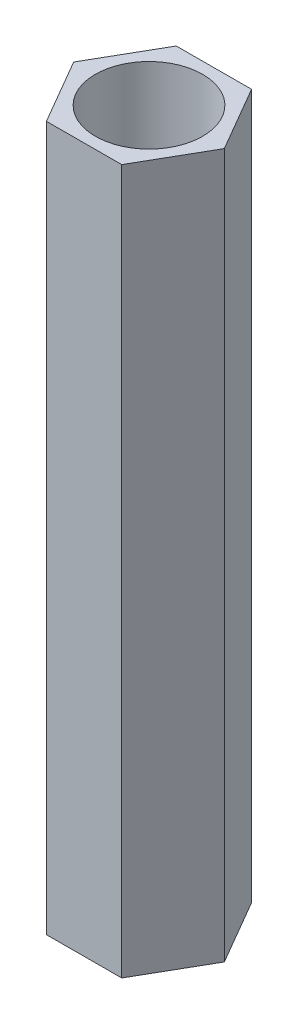
ISO-10303-21;
HEADER;
FILE_DESCRIPTION(('STEP AP214'),'2;1');
FILE_NAME('part.step','',(''),(''),'','','');
FILE_SCHEMA(('AUTOMOTIVE_DESIGN { 1 0 10303 214 1 1 1 1 }'));
ENDSEC;
DATA;
#1=APPLICATION_CONTEXT('core data for automotive mechanical design processes');
#2=APPLICATION_PROTOCOL_DEFINITION('international standard','automotive_design',2000,#1);
#3=PRODUCT_CONTEXT('',#1,'mechanical');
#4=PRODUCT('Part','Part','',(#3));
#5=PRODUCT_RELATED_PRODUCT_CATEGORY('part','',(#4));
#6=PRODUCT_DEFINITION_FORMATION('','',#4);
#7=PRODUCT_DEFINITION_CONTEXT('part definition',#1,'design');
#8=PRODUCT_DEFINITION('design','',#6,#7);
#9=PRODUCT_DEFINITION_SHAPE('','',#8);
#10=(LENGTH_UNIT() NAMED_UNIT(*) SI_UNIT(.MILLI.,.METRE.));
#11=(NAMED_UNIT(*) PLANE_ANGLE_UNIT() SI_UNIT($,.RADIAN.));
#12=(NAMED_UNIT(*) SI_UNIT($,.STERADIAN.) SOLID_ANGLE_UNIT());
#13=UNCERTAINTY_MEASURE_WITH_UNIT(LENGTH_MEASURE(1.E-05),#10,'distance_accuracy_value','');
#14=(GEOMETRIC_REPRESENTATION_CONTEXT(3) GLOBAL_UNCERTAINTY_ASSIGNED_CONTEXT((#13)) GLOBAL_UNIT_ASSIGNED_CONTEXT((#10,
#11,#12)) REPRESENTATION_CONTEXT('',''));
#15=CARTESIAN_POINT('',(0.,0.,0.));
#16=DIRECTION('',(0.,0.,1.));
#17=DIRECTION('',(1.,0.,0.));
#18=AXIS2_PLACEMENT_3D('',#15,#16,#17);
#19=CARTESIAN_POINT('',(0.,21.65,0.));
#20=DIRECTION('',(0.,1.,0.));
#21=DIRECTION('',(0.,0.,1.));
#22=AXIS2_PLACEMENT_3D('',#19,#20,#21);
#23=PLANE('',#22);
#24=DIRECTION('',(0.999996955369574,0.,-0.00246764089411846));
#25=VECTOR('',#24,1.);
#26=CARTESIAN_POINT('',(-1.14976174095462,21.65,2.00284329700811));
#27=LINE('',#26,#25);
#28=CARTESIAN_POINT('',(-1.14976174095462,21.65,2.00284329700811));
#29=VERTEX_POINT('',#28);
#30=CARTESIAN_POINT('',(1.1596323045311,21.65,1.99714452447018));
#31=VERTEX_POINT('',#30);
#32=EDGE_CURVE('E129',#29,#31,#27,.T.);
#33=ORIENTED_EDGE('',*,*,#32,.T.);
#34=DIRECTION('',(0.497861437983062,0.,-0.867256587504204));
#35=VECTOR('',#34,1.);
#36=CARTESIAN_POINT('',(1.1596323045311,21.65,1.99714452447018));
#37=LINE('',#36,#35);
#38=CARTESIAN_POINT('',(2.30939404548572,21.65,-0.00569877253793042));
#39=VERTEX_POINT('',#38);
#40=EDGE_CURVE('E87',#31,#39,#37,.T.);
#41=ORIENTED_EDGE('',*,*,#40,.T.);
#42=DIRECTION('',(-0.502135517386511,0.,-0.864788946610085));
#43=VECTOR('',#42,1.);
#44=CARTESIAN_POINT('',(2.30939404548572,21.65,-0.00569877253793042));
#45=LINE('',#44,#43);
#46=CARTESIAN_POINT('',(1.14976174095462,21.65,-2.00284329700811));
#47=VERTEX_POINT('',#46);
#48=EDGE_CURVE('E100',#39,#47,#45,.T.);
#49=ORIENTED_EDGE('',*,*,#48,.T.);
#50=DIRECTION('',(-0.999996955369574,0.,0.00246764089411808));
#51=VECTOR('',#50,1.);
#52=CARTESIAN_POINT('',(1.14976174095462,21.65,-2.00284329700811));
#53=LINE('',#52,#51);
#54=CARTESIAN_POINT('',(-1.1596323045311,21.65,-1.99714452447018));
#55=VERTEX_POINT('',#54);
#56=EDGE_CURVE('E94',#47,#55,#53,.T.);
#57=ORIENTED_EDGE('',*,*,#56,.T.);
#58=DIRECTION('',(-0.497861437983063,0.,0.867256587504204));
#59=VECTOR('',#58,1.);
#60=CARTESIAN_POINT('',(-1.1596323045311,21.65,-1.99714452447018));
#61=LINE('',#60,#59);
#62=CARTESIAN_POINT('',(-2.30939404548572,21.65,0.00569877253793051));
#63=VERTEX_POINT('',#62);
#64=EDGE_CURVE('E98',#55,#63,#61,.T.);
#65=ORIENTED_EDGE('',*,*,#64,.T.);
#66=DIRECTION('',(0.502135517386511,0.,0.864788946610085));
#67=VECTOR('',#66,1.);
#68=CARTESIAN_POINT('',(-2.30939404548572,21.65,0.00569877253793051));
#69=LINE('',#68,#67);
#70=EDGE_CURVE('E50',#63,#29,#69,.T.);
#71=ORIENTED_EDGE('',*,*,#70,.T.);
#72=EDGE_LOOP('',(#33,#41,#49,#57,#65,#71));
#73=FACE_BOUND('',#72,.T.);
#74=CARTESIAN_POINT('',(0.,21.65,0.));
#75=DIRECTION('',(0.,1.,0.));
#76=DIRECTION('',(0.,0.,1.));
#77=AXIS2_PLACEMENT_3D('',#74,#75,#76);
#78=CIRCLE('',#77,1.65);
#79=CARTESIAN_POINT('',(0.,21.65,-1.65));
#80=VERTEX_POINT('',#79);
#81=EDGE_CURVE('E122',#80,#80,#78,.T.);
#82=ORIENTED_EDGE('',*,*,#81,.F.);
#83=EDGE_LOOP('',(#82));
#84=FACE_BOUND('',#83,.T.);
#85=ADVANCED_FACE('F33',(#73,#84),#23,.T.);
#86=CARTESIAN_POINT('',(0.,0.,0.));
#87=DIRECTION('',(0.,1.,0.));
#88=DIRECTION('',(0.,0.,1.));
#89=AXIS2_PLACEMENT_3D('',#86,#87,#88);
#90=PLANE('',#89);
#91=DIRECTION('',(0.999996955369574,0.,-0.00246764089411846));
#92=VECTOR('',#91,1.);
#93=CARTESIAN_POINT('',(-1.14976174095462,0.,2.00284329700811));
#94=LINE('',#93,#92);
#95=CARTESIAN_POINT('',(-1.14976174095462,0.,2.00284329700811));
#96=VERTEX_POINT('',#95);
#97=CARTESIAN_POINT('',(1.1596323045311,0.,1.99714452447018));
#98=VERTEX_POINT('',#97);
#99=EDGE_CURVE('E118',#96,#98,#94,.T.);
#100=ORIENTED_EDGE('',*,*,#99,.F.);
#101=DIRECTION('',(0.502135517386511,0.,0.864788946610085));
#102=VECTOR('',#101,1.);
#103=CARTESIAN_POINT('',(-2.30939404548572,0.,0.00569877253793051));
#104=LINE('',#103,#102);
#105=CARTESIAN_POINT('',(-2.30939404548572,0.,0.00569877253793051));
#106=VERTEX_POINT('',#105);
#107=EDGE_CURVE('E79',#106,#96,#104,.T.);
#108=ORIENTED_EDGE('',*,*,#107,.F.);
#109=DIRECTION('',(-0.497861437983063,0.,0.867256587504204));
#110=VECTOR('',#109,1.);
#111=CARTESIAN_POINT('',(-1.1596323045311,0.,-1.99714452447018));
#112=LINE('',#111,#110);
#113=CARTESIAN_POINT('',(-1.1596323045311,0.,-1.99714452447018));
#114=VERTEX_POINT('',#113);
#115=EDGE_CURVE('E73',#114,#106,#112,.T.);
#116=ORIENTED_EDGE('',*,*,#115,.F.);
#117=DIRECTION('',(-0.999996955369574,0.,0.00246764089411808));
#118=VECTOR('',#117,1.);
#119=CARTESIAN_POINT('',(1.14976174095462,0.,-2.00284329700811));
#120=LINE('',#119,#118);
#121=CARTESIAN_POINT('',(1.14976174095462,0.,-2.00284329700811));
#122=VERTEX_POINT('',#121);
#123=EDGE_CURVE('E108',#122,#114,#120,.T.);
#124=ORIENTED_EDGE('',*,*,#123,.F.);
#125=DIRECTION('',(-0.502135517386511,0.,-0.864788946610085));
#126=VECTOR('',#125,1.);
#127=CARTESIAN_POINT('',(2.30939404548572,0.,-0.00569877253793042));
#128=LINE('',#127,#126);
#129=CARTESIAN_POINT('',(2.30939404548572,0.,-0.00569877253793042));
#130=VERTEX_POINT('',#129);
#131=EDGE_CURVE('E124',#130,#122,#128,.T.);
#132=ORIENTED_EDGE('',*,*,#131,.F.);
#133=DIRECTION('',(0.497861437983062,0.,-0.867256587504204));
#134=VECTOR('',#133,1.);
#135=CARTESIAN_POINT('',(1.1596323045311,0.,1.99714452447018));
#136=LINE('',#135,#134);
#137=EDGE_CURVE('E121',#98,#130,#136,.T.);
#138=ORIENTED_EDGE('',*,*,#137,.F.);
#139=EDGE_LOOP('',(#100,#108,#116,#124,#132,#138));
#140=FACE_BOUND('',#139,.T.);
#141=CARTESIAN_POINT('',(0.,0.,0.));
#142=DIRECTION('',(0.,1.,0.));
#143=DIRECTION('',(0.,0.,1.));
#144=AXIS2_PLACEMENT_3D('',#141,#142,#143);
#145=CIRCLE('',#144,1.65);
#146=CARTESIAN_POINT('',(0.,0.,-1.65));
#147=VERTEX_POINT('',#146);
#148=EDGE_CURVE('E222',#147,#147,#145,.T.);
#149=ORIENTED_EDGE('',*,*,#148,.T.);
#150=EDGE_LOOP('',(#149));
#151=FACE_BOUND('',#150,.T.);
#152=ADVANCED_FACE('F138',(#140,#151),#90,.F.);
#153=CARTESIAN_POINT('',(-1.14976174095462,21.65,2.00284329700811));
#154=DIRECTION('',(-0.00246764089411846,0.,-0.999996955369574));
#155=DIRECTION('',(-0.999996955369574,0.,0.00246764089411846));
#156=AXIS2_PLACEMENT_3D('',#153,#154,#155);
#157=PLANE('',#156);
#158=ORIENTED_EDGE('',*,*,#99,.T.);
#159=DIRECTION('',(0.,-1.,0.));
#160=VECTOR('',#159,1.);
#161=CARTESIAN_POINT('',(1.1596323045311,21.65,1.99714452447018));
#162=LINE('',#161,#160);
#163=EDGE_CURVE('E11',#31,#98,#162,.T.);
#164=ORIENTED_EDGE('',*,*,#163,.F.);
#165=ORIENTED_EDGE('',*,*,#32,.F.);
#166=DIRECTION('',(0.,-1.,0.));
#167=VECTOR('',#166,1.);
#168=CARTESIAN_POINT('',(-1.14976174095462,21.65,2.00284329700811));
#169=LINE('',#168,#167);
#170=EDGE_CURVE('E114',#29,#96,#169,.T.);
#171=ORIENTED_EDGE('',*,*,#170,.T.);
#172=EDGE_LOOP('',(#158,#164,#165,#171));
#173=FACE_BOUND('',#172,.T.);
#174=ADVANCED_FACE('F35',(#173),#157,.F.);
#175=CARTESIAN_POINT('',(1.1596323045311,21.65,1.99714452447018));
#176=DIRECTION('',(-0.867256587504204,0.,-0.497861437983063));
#177=DIRECTION('',(-0.497861437983063,0.,0.867256587504204));
#178=AXIS2_PLACEMENT_3D('',#175,#176,#177);
#179=PLANE('',#178);
#180=ORIENTED_EDGE('',*,*,#137,.T.);
#181=DIRECTION('',(0.,-1.,0.));
#182=VECTOR('',#181,1.);
#183=CARTESIAN_POINT('',(2.30939404548572,21.65,-0.00569877253793042));
#184=LINE('',#183,#182);
#185=EDGE_CURVE('E42',#39,#130,#184,.T.);
#186=ORIENTED_EDGE('',*,*,#185,.F.);
#187=ORIENTED_EDGE('',*,*,#40,.F.);
#188=ORIENTED_EDGE('',*,*,#163,.T.);
#189=EDGE_LOOP('',(#180,#186,#187,#188));
#190=FACE_BOUND('',#189,.T.);
#191=ADVANCED_FACE('F163',(#190),#179,.F.);
#192=CARTESIAN_POINT('',(2.30939404548572,21.65,-0.00569877253793042));
#193=DIRECTION('',(-0.864788946610085,0.,0.502135517386511));
#194=DIRECTION('',(0.502135517386511,0.,0.864788946610086));
#195=AXIS2_PLACEMENT_3D('',#192,#193,#194);
#196=PLANE('',#195);
#197=ORIENTED_EDGE('',*,*,#131,.T.);
#198=DIRECTION('',(0.,-1.,0.));
#199=VECTOR('',#198,1.);
#200=CARTESIAN_POINT('',(1.14976174095462,21.65,-2.00284329700811));
#201=LINE('',#200,#199);
#202=EDGE_CURVE('E109',#47,#122,#201,.T.);
#203=ORIENTED_EDGE('',*,*,#202,.F.);
#204=ORIENTED_EDGE('',*,*,#48,.F.);
#205=ORIENTED_EDGE('',*,*,#185,.T.);
#206=EDGE_LOOP('',(#197,#203,#204,#205));
#207=FACE_BOUND('',#206,.T.);
#208=ADVANCED_FACE('F135',(#207),#196,.F.);
#209=CARTESIAN_POINT('',(1.14976174095462,21.65,-2.00284329700811));
#210=DIRECTION('',(0.00246764089411808,0.,0.999996955369574));
#211=DIRECTION('',(0.999996955369574,0.,-0.00246764089411808));
#212=AXIS2_PLACEMENT_3D('',#209,#210,#211);
#213=PLANE('',#212);
#214=ORIENTED_EDGE('',*,*,#123,.T.);
#215=DIRECTION('',(0.,-1.,0.));
#216=VECTOR('',#215,1.);
#217=CARTESIAN_POINT('',(-1.1596323045311,21.65,-1.99714452447018));
#218=LINE('',#217,#216);
#219=EDGE_CURVE('E105',#55,#114,#218,.T.);
#220=ORIENTED_EDGE('',*,*,#219,.F.);
#221=ORIENTED_EDGE('',*,*,#56,.F.);
#222=ORIENTED_EDGE('',*,*,#202,.T.);
#223=EDGE_LOOP('',(#214,#220,#221,#222));
#224=FACE_BOUND('',#223,.T.);
#225=ADVANCED_FACE('F106',(#224),#213,.F.);
#226=CARTESIAN_POINT('',(-1.1596323045311,21.65,-1.99714452447018));
#227=DIRECTION('',(0.867256587504204,0.,0.497861437983063));
#228=DIRECTION('',(0.497861437983063,0.,-0.867256587504204));
#229=AXIS2_PLACEMENT_3D('',#226,#227,#228);
#230=PLANE('',#229);
#231=ORIENTED_EDGE('',*,*,#115,.T.);
#232=DIRECTION('',(0.,-1.,0.));
#233=VECTOR('',#232,1.);
#234=CARTESIAN_POINT('',(-2.30939404548572,21.65,0.00569877253793051));
#235=LINE('',#234,#233);
#236=EDGE_CURVE('E110',#63,#106,#235,.T.);
#237=ORIENTED_EDGE('',*,*,#236,.F.);
#238=ORIENTED_EDGE('',*,*,#64,.F.);
#239=ORIENTED_EDGE('',*,*,#219,.T.);
#240=EDGE_LOOP('',(#231,#237,#238,#239));
#241=FACE_BOUND('',#240,.T.);
#242=ADVANCED_FACE('F112',(#241),#230,.F.);
#243=CARTESIAN_POINT('',(-2.30939404548572,21.65,0.00569877253793051));
#244=DIRECTION('',(0.864788946610085,0.,-0.502135517386511));
#245=DIRECTION('',(-0.502135517386511,0.,-0.864788946610085));
#246=AXIS2_PLACEMENT_3D('',#243,#244,#245);
#247=PLANE('',#246);
#248=ORIENTED_EDGE('',*,*,#107,.T.);
#249=ORIENTED_EDGE('',*,*,#170,.F.);
#250=ORIENTED_EDGE('',*,*,#70,.F.);
#251=ORIENTED_EDGE('',*,*,#236,.T.);
#252=EDGE_LOOP('',(#248,#249,#250,#251));
#253=FACE_BOUND('',#252,.T.);
#254=ADVANCED_FACE('F143',(#253),#247,.F.);
#255=CARTESIAN_POINT('',(0.,21.65,0.));
#256=DIRECTION('',(0.,-1.,0.));
#257=DIRECTION('',(0.,0.,-1.));
#258=AXIS2_PLACEMENT_3D('',#255,#256,#257);
#259=CYLINDRICAL_SURFACE('',#258,1.65);
#260=CARTESIAN_POINT('',(0.,21.65,-1.65));
#261=CARTESIAN_POINT('',(0.,21.4244791666667,-1.65));
#262=CARTESIAN_POINT('',(0.,21.1989583333333,-1.65));
#263=CARTESIAN_POINT('',(0.,20.7479166666667,-1.65));
#264=CARTESIAN_POINT('',(0.,20.5223958333333,-1.65));
#265=CARTESIAN_POINT('',(0.,20.0713541666667,-1.65));
#266=CARTESIAN_POINT('',(0.,19.8458333333333,-1.65));
#267=CARTESIAN_POINT('',(0.,19.3947916666667,-1.65));
#268=CARTESIAN_POINT('',(0.,19.1692708333333,-1.65));
#269=CARTESIAN_POINT('',(0.,18.7182291666667,-1.65));
#270=CARTESIAN_POINT('',(0.,18.4927083333333,-1.65));
#271=CARTESIAN_POINT('',(0.,18.0416666666667,-1.65));
#272=CARTESIAN_POINT('',(0.,17.8161458333333,-1.65));
#273=CARTESIAN_POINT('',(0.,17.3651041666667,-1.65));
#274=CARTESIAN_POINT('',(0.,17.1395833333333,-1.65));
#275=CARTESIAN_POINT('',(0.,16.6885416666667,-1.65));
#276=CARTESIAN_POINT('',(0.,16.4630208333333,-1.65));
#277=CARTESIAN_POINT('',(0.,16.0119791666667,-1.65));
#278=CARTESIAN_POINT('',(0.,15.7864583333333,-1.65));
#279=CARTESIAN_POINT('',(0.,15.3354166666667,-1.65));
#280=CARTESIAN_POINT('',(0.,15.1098958333333,-1.65));
#281=CARTESIAN_POINT('',(0.,14.6588541666667,-1.65));
#282=CARTESIAN_POINT('',(0.,14.4333333333333,-1.65));
#283=CARTESIAN_POINT('',(0.,13.9822916666667,-1.65));
#284=CARTESIAN_POINT('',(0.,13.7567708333333,-1.65));
#285=CARTESIAN_POINT('',(0.,13.3057291666667,-1.65));
#286=CARTESIAN_POINT('',(0.,13.0802083333333,-1.65));
#287=CARTESIAN_POINT('',(0.,12.6291666666667,-1.65));
#288=CARTESIAN_POINT('',(0.,12.4036458333333,-1.65));
#289=CARTESIAN_POINT('',(0.,11.9526041666667,-1.65));
#290=CARTESIAN_POINT('',(0.,11.7270833333333,-1.65));
#291=CARTESIAN_POINT('',(0.,11.2760416666667,-1.65));
#292=CARTESIAN_POINT('',(0.,11.0505208333333,-1.65));
#293=CARTESIAN_POINT('',(0.,10.5994791666667,-1.65));
#294=CARTESIAN_POINT('',(0.,10.3739583333333,-1.65));
#295=CARTESIAN_POINT('',(0.,9.92291666666667,-1.65));
#296=CARTESIAN_POINT('',(0.,9.69739583333333,-1.65));
#297=CARTESIAN_POINT('',(0.,9.24635416666667,-1.65));
#298=CARTESIAN_POINT('',(0.,9.02083333333333,-1.65));
#299=CARTESIAN_POINT('',(0.,8.56979166666667,-1.65));
#300=CARTESIAN_POINT('',(0.,8.34427083333333,-1.65));
#301=CARTESIAN_POINT('',(0.,7.89322916666667,-1.65));
#302=CARTESIAN_POINT('',(0.,7.66770833333333,-1.65));
#303=CARTESIAN_POINT('',(0.,7.21666666666667,-1.65));
#304=CARTESIAN_POINT('',(0.,6.99114583333333,-1.65));
#305=CARTESIAN_POINT('',(0.,6.54010416666667,-1.65));
#306=CARTESIAN_POINT('',(0.,6.31458333333333,-1.65));
#307=CARTESIAN_POINT('',(0.,5.86354166666667,-1.65));
#308=CARTESIAN_POINT('',(0.,5.63802083333333,-1.65));
#309=CARTESIAN_POINT('',(0.,5.18697916666667,-1.65));
#310=CARTESIAN_POINT('',(0.,4.96145833333333,-1.65));
#311=CARTESIAN_POINT('',(0.,4.51041666666667,-1.65));
#312=CARTESIAN_POINT('',(0.,4.28489583333333,-1.65));
#313=CARTESIAN_POINT('',(0.,3.83385416666667,-1.65));
#314=CARTESIAN_POINT('',(0.,3.60833333333333,-1.65));
#315=CARTESIAN_POINT('',(0.,3.15729166666667,-1.65));
#316=CARTESIAN_POINT('',(0.,2.93177083333333,-1.65));
#317=CARTESIAN_POINT('',(0.,2.48072916666667,-1.65));
#318=CARTESIAN_POINT('',(0.,2.25520833333333,-1.65));
#319=CARTESIAN_POINT('',(0.,1.80416666666667,-1.65));
#320=CARTESIAN_POINT('',(0.,1.57864583333333,-1.65));
#321=CARTESIAN_POINT('',(0.,1.12760416666667,-1.65));
#322=CARTESIAN_POINT('',(0.,0.902083333333332,-1.65));
#323=CARTESIAN_POINT('',(0.,0.451041666666665,-1.65));
#324=CARTESIAN_POINT('',(0.,0.225520833333333,-1.65));
#325=CARTESIAN_POINT('',(0.,0.,-1.65));
#326=B_SPLINE_CURVE_WITH_KNOTS('',3,(#260,#261,#262,#263,#264,#265,#266,#267,#268,#269,#270,
#271,#272,#273,#274,#275,#276,#277,#278,#279,#280,#281,#282,#283,#284,#285,#286,#287,#288,#289,
#290,#291,#292,#293,#294,#295,#296,#297,#298,#299,#300,#301,#302,#303,#304,#305,#306,#307,#308,
#309,#310,#311,#312,#313,#314,#315,#316,#317,#318,#319,#320,#321,#322,#323,#324,#325),
.UNSPECIFIED.,.F.,.F.,(4,2,2,2,2,2,2,2,2,2,2,2,2,2,2,2,2,2,2,2,2,2,2,2,2,2,2,2,2,2,2,2,4),(0.,
0.676562499999998,1.353125,2.0296875,2.70625,3.3828125,4.059375,4.7359375,5.4125,6.0890625,
6.765625,7.4421875,8.11875,8.7953125,9.471875,10.1484375,10.825,11.5015625,12.178125,12.8546875,
13.53125,14.2078125,14.884375,15.5609375,16.2375,16.9140625,17.590625,18.2671875,18.94375,
19.6203125,20.296875,20.9734375,21.65),.UNSPECIFIED.);
#327=EDGE_CURVE('BSEAM145',#80,#147,#326,.T.);
#328=ORIENTED_EDGE('',*,*,#81,.T.);
#329=ORIENTED_EDGE('',*,*,#148,.F.);
#330=ORIENTED_EDGE('',*,*,#327,.T.);
#331=ORIENTED_EDGE('',*,*,#327,.F.);
#332=EDGE_LOOP('',(#328,#330,#329,#331));
#333=FACE_BOUND('',#332,.T.);
#334=ADVANCED_FACE('F145',(#333),#259,.F.);
#335=CLOSED_SHELL('',(#85,#152,#174,#191,#208,#225,#242,#254,#334));
#336=MANIFOLD_SOLID_BREP('B2',#335);
#337=ADVANCED_BREP_SHAPE_REPRESENTATION('',(#18,#336),#14);
#338=SHAPE_DEFINITION_REPRESENTATION(#9,#337);
ENDSEC;
END-ISO-10303-21;
